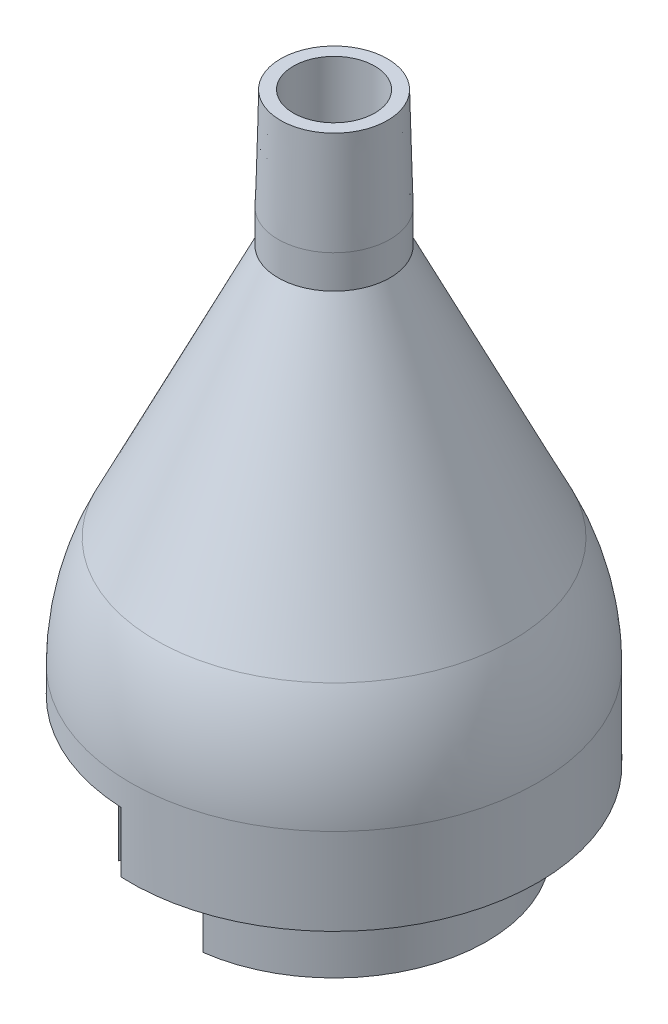
ISO-10303-21;
HEADER;
FILE_DESCRIPTION(('STEP AP214'),'2;1');
FILE_NAME('part.step','',(''),(''),'','','');
FILE_SCHEMA(('AUTOMOTIVE_DESIGN { 1 0 10303 214 1 1 1 1 }'));
ENDSEC;
DATA;
#1=APPLICATION_CONTEXT('core data for automotive mechanical design processes');
#2=APPLICATION_PROTOCOL_DEFINITION('international standard','automotive_design',2000,#1);
#3=PRODUCT_CONTEXT('',#1,'mechanical');
#4=PRODUCT('Part','Part','',(#3));
#5=PRODUCT_RELATED_PRODUCT_CATEGORY('part','',(#4));
#6=PRODUCT_DEFINITION_FORMATION('','',#4);
#7=PRODUCT_DEFINITION_CONTEXT('part definition',#1,'design');
#8=PRODUCT_DEFINITION('design','',#6,#7);
#9=PRODUCT_DEFINITION_SHAPE('','',#8);
#10=(LENGTH_UNIT() NAMED_UNIT(*) SI_UNIT(.MILLI.,.METRE.));
#11=(NAMED_UNIT(*) PLANE_ANGLE_UNIT() SI_UNIT($,.RADIAN.));
#12=(NAMED_UNIT(*) SI_UNIT($,.STERADIAN.) SOLID_ANGLE_UNIT());
#13=UNCERTAINTY_MEASURE_WITH_UNIT(LENGTH_MEASURE(1.E-05),#10,'distance_accuracy_value','');
#14=(GEOMETRIC_REPRESENTATION_CONTEXT(3) GLOBAL_UNCERTAINTY_ASSIGNED_CONTEXT((#13)) GLOBAL_UNIT_ASSIGNED_CONTEXT((#10,
#11,#12)) REPRESENTATION_CONTEXT('',''));
#15=CARTESIAN_POINT('',(0.,0.,0.));
#16=DIRECTION('',(0.,0.,1.));
#17=DIRECTION('',(1.,0.,0.));
#18=AXIS2_PLACEMENT_3D('',#15,#16,#17);
#19=CARTESIAN_POINT('',(0.,0.,0.));
#20=DIRECTION('',(0.,1.,0.));
#21=DIRECTION('',(0.,0.,1.));
#22=AXIS2_PLACEMENT_3D('',#19,#20,#21);
#23=PLANE('',#22);
#24=CARTESIAN_POINT('',(-21.1602690825293,0.,-29.1246117974979));
#25=DIRECTION('',(0.,-1.,0.));
#26=DIRECTION('',(0.,0.,-1.));
#27=AXIS2_PLACEMENT_3D('',#24,#25,#26);
#28=CIRCLE('',#27,1.5);
#29=CARTESIAN_POINT('',(-21.1602690825293,0.,-30.6246117974979));
#30=VERTEX_POINT('',#29);
#31=EDGE_CURVE('E394',#30,#30,#28,.T.);
#32=ORIENTED_EDGE('',*,*,#31,.F.);
#33=EDGE_LOOP('',(#32));
#34=FACE_BOUND('',#33,.T.);
#35=CARTESIAN_POINT('',(-34.2380345866256,0.,-11.1246117974978));
#36=DIRECTION('',(0.,-1.,0.));
#37=DIRECTION('',(0.,0.,-1.));
#38=AXIS2_PLACEMENT_3D('',#35,#36,#37);
#39=CIRCLE('',#38,1.5);
#40=CARTESIAN_POINT('',(-34.2380345866256,0.,-12.6246117974978));
#41=VERTEX_POINT('',#40);
#42=EDGE_CURVE('E386',#41,#41,#39,.T.);
#43=ORIENTED_EDGE('',*,*,#42,.F.);
#44=EDGE_LOOP('',(#43));
#45=FACE_BOUND('',#44,.T.);
#46=CARTESIAN_POINT('',(-34.2380345866254,0.,11.1246117974985));
#47=DIRECTION('',(0.,-1.,0.));
#48=DIRECTION('',(0.,0.,-1.));
#49=AXIS2_PLACEMENT_3D('',#46,#47,#48);
#50=CIRCLE('',#49,1.5);
#51=CARTESIAN_POINT('',(-34.2380345866254,0.,9.62461179749849));
#52=VERTEX_POINT('',#51);
#53=EDGE_CURVE('E393',#52,#52,#50,.T.);
#54=ORIENTED_EDGE('',*,*,#53,.F.);
#55=EDGE_LOOP('',(#54));
#56=FACE_BOUND('',#55,.T.);
#57=DIRECTION('',(-0.819178042205052,0.,0.573539305688021));
#58=VECTOR('',#57,1.);
#59=CARTESIAN_POINT('',(-3.81627640035369,0.,-5.45073336587605));
#60=LINE('',#59,#58);
#61=CARTESIAN_POINT('',(-30.2939246678071,0.,13.0873270082637));
#62=VERTEX_POINT('',#61);
#63=CARTESIAN_POINT('',(-36.126859333869,0.,17.1711978228324));
#64=VERTEX_POINT('',#63);
#65=EDGE_CURVE('E378',#62,#64,#60,.T.);
#66=ORIENTED_EDGE('',*,*,#65,.T.);
#67=CARTESIAN_POINT('',(0.,0.,0.));
#68=DIRECTION('',(0.,1.,0.));
#69=DIRECTION('',(0.,0.,1.));
#70=AXIS2_PLACEMENT_3D('',#67,#68,#69);
#71=CIRCLE('',#70,40.);
#72=CARTESIAN_POINT('',(-19.5058879135128,0.,-34.9216313580204));
#73=VERTEX_POINT('',#72);
#74=EDGE_CURVE('E230',#73,#64,#71,.T.);
#75=ORIENTED_EDGE('',*,*,#74,.F.);
#76=DIRECTION('',(-0.487647197837817,0.,-0.873040783950512));
#77=VECTOR('',#76,1.);
#78=CARTESIAN_POINT('',(-1.40847043936586E-13,0.,0.));
#79=LINE('',#78,#77);
#80=CARTESIAN_POINT('',(-16.0923575286481,0.,-28.8103458703668));
#81=VERTEX_POINT('',#80);
#82=EDGE_CURVE('E429',#81,#73,#79,.T.);
#83=ORIENTED_EDGE('',*,*,#82,.F.);
#84=CARTESIAN_POINT('',(0.,0.,0.));
#85=DIRECTION('',(0.,-1.,0.));
#86=DIRECTION('',(0.,0.,-1.));
#87=AXIS2_PLACEMENT_3D('',#84,#85,#86);
#88=CIRCLE('',#87,33.);
#89=EDGE_CURVE('E426',#62,#81,#88,.T.);
#90=ORIENTED_EDGE('',*,*,#89,.F.);
#91=EDGE_LOOP('',(#66,#75,#83,#90));
#92=FACE_BOUND('',#91,.T.);
#93=ADVANCED_FACE('F105',(#34,#45,#56,#92),#23,.F.);
#94=CARTESIAN_POINT('',(0.,50.,0.));
#95=DIRECTION('',(0.,-1.,0.));
#96=DIRECTION('',(0.,0.,-1.));
#97=AXIS2_PLACEMENT_3D('',#94,#95,#96);
#98=CYLINDRICAL_SURFACE('',#97,40.);
#99=CARTESIAN_POINT('',(0.,17.0080650353958,0.));
#100=DIRECTION('',(0.,-1.,0.));
#101=DIRECTION('',(0.,0.,-1.));
#102=AXIS2_PLACEMENT_3D('',#99,#100,#101);
#103=CIRCLE('',#102,40.);
#104=CARTESIAN_POINT('',(0.,17.0080650353958,-40.));
#105=VERTEX_POINT('',#104);
#106=EDGE_CURVE('E608',#105,#105,#103,.T.);
#107=ORIENTED_EDGE('',*,*,#106,.T.);
#108=EDGE_LOOP('',(#107));
#109=FACE_BOUND('',#108,.T.);
#110=DIRECTION('',(0.,-1.,0.));
#111=VECTOR('',#110,1.);
#112=CARTESIAN_POINT('',(-36.126859333869,11.84997677,17.1711978228324));
#113=LINE('',#112,#111);
#114=CARTESIAN_POINT('',(-36.126859333869,11.84997677,17.1711978228324));
#115=VERTEX_POINT('',#114);
#116=EDGE_CURVE('E440',#115,#64,#113,.T.);
#117=ORIENTED_EDGE('',*,*,#116,.F.);
#118=CARTESIAN_POINT('',(0.,11.84997677,0.));
#119=DIRECTION('',(0.,-1.,0.));
#120=DIRECTION('',(0.,0.,-1.));
#121=AXIS2_PLACEMENT_3D('',#118,#119,#120);
#122=CIRCLE('',#121,40.);
#123=CARTESIAN_POINT('',(-1.9505371321681,11.84997677,39.9524142561627));
#124=VERTEX_POINT('',#123);
#125=EDGE_CURVE('E245',#124,#115,#122,.T.);
#126=ORIENTED_EDGE('',*,*,#125,.F.);
#127=DIRECTION('',(0.,-1.,0.));
#128=VECTOR('',#127,1.);
#129=CARTESIAN_POINT('',(-1.9505371321681,11.84997677,39.9524142561627));
#130=LINE('',#129,#128);
#131=CARTESIAN_POINT('',(-1.9505371321681,0.,39.9524142561627));
#132=VERTEX_POINT('',#131);
#133=EDGE_CURVE('E384',#124,#132,#130,.T.);
#134=ORIENTED_EDGE('',*,*,#133,.T.);
#135=CARTESIAN_POINT('',(4.19737007297038,0.,-39.7791664627419));
#136=VERTEX_POINT('',#135);
#137=EDGE_CURVE('E381',#132,#136,#71,.T.);
#138=ORIENTED_EDGE('',*,*,#137,.T.);
#139=DIRECTION('',(0.,-1.,0.));
#140=VECTOR('',#139,1.);
#141=CARTESIAN_POINT('',(4.19737007297038,11.84997677,-39.7791664627419));
#142=LINE('',#141,#140);
#143=CARTESIAN_POINT('',(4.19737007297038,11.84997677,-39.7791664627419));
#144=VERTEX_POINT('',#143);
#145=EDGE_CURVE('E432',#144,#136,#142,.T.);
#146=ORIENTED_EDGE('',*,*,#145,.F.);
#147=CARTESIAN_POINT('',(-19.5058879135128,11.84997677,-34.9216313580204));
#148=VERTEX_POINT('',#147);
#149=EDGE_CURVE('E250',#148,#144,#122,.T.);
#150=ORIENTED_EDGE('',*,*,#149,.F.);
#151=DIRECTION('',(0.,-1.,0.));
#152=VECTOR('',#151,1.);
#153=CARTESIAN_POINT('',(-19.5058879135128,11.84997677,-34.9216313580204));
#154=LINE('',#153,#152);
#155=EDGE_CURVE('E383',#148,#73,#154,.T.);
#156=ORIENTED_EDGE('',*,*,#155,.T.);
#157=ORIENTED_EDGE('',*,*,#74,.T.);
#158=EDGE_LOOP('',(#117,#126,#134,#138,#146,#150,#156,#157));
#159=FACE_BOUND('',#158,.T.);
#160=ADVANCED_FACE('F482',(#109,#159),#98,.T.);
#161=CARTESIAN_POINT('',(21.1602690825291,0.,29.1246117974981));
#162=DIRECTION('',(0.,-1.,0.));
#163=DIRECTION('',(0.,0.,-1.));
#164=AXIS2_PLACEMENT_3D('',#161,#162,#163);
#165=CIRCLE('',#164,1.5);
#166=CARTESIAN_POINT('',(21.1602690825291,0.,27.6246117974981));
#167=VERTEX_POINT('',#166);
#168=EDGE_CURVE('E416',#167,#167,#165,.T.);
#169=ORIENTED_EDGE('',*,*,#168,.F.);
#170=EDGE_LOOP('',(#169));
#171=FACE_BOUND('',#170,.T.);
#172=CARTESIAN_POINT('',(34.2380345866255,0.,-11.1246117974983));
#173=DIRECTION('',(0.,-1.,0.));
#174=DIRECTION('',(0.,0.,-1.));
#175=AXIS2_PLACEMENT_3D('',#172,#173,#174);
#176=CIRCLE('',#175,1.5);
#177=CARTESIAN_POINT('',(34.2380345866255,0.,-12.6246117974983));
#178=VERTEX_POINT('',#177);
#179=EDGE_CURVE('E400',#178,#178,#176,.T.);
#180=ORIENTED_EDGE('',*,*,#179,.F.);
#181=EDGE_LOOP('',(#180));
#182=FACE_BOUND('',#181,.T.);
#183=CARTESIAN_POINT('',(34.2380345866256,0.,11.124611797498));
#184=DIRECTION('',(0.,-1.,0.));
#185=DIRECTION('',(0.,0.,-1.));
#186=AXIS2_PLACEMENT_3D('',#183,#184,#185);
#187=CIRCLE('',#186,1.5);
#188=CARTESIAN_POINT('',(34.2380345866256,0.,9.62461179749802));
#189=VERTEX_POINT('',#188);
#190=EDGE_CURVE('E406',#189,#189,#187,.T.);
#191=ORIENTED_EDGE('',*,*,#190,.F.);
#192=EDGE_LOOP('',(#191));
#193=FACE_BOUND('',#192,.T.);
#194=ORIENTED_EDGE('',*,*,#137,.F.);
#195=DIRECTION('',(-0.0487634283041756,0.,0.998810356404069));
#196=VECTOR('',#195,1.);
#197=CARTESIAN_POINT('',(-1.07793096146607E-12,0.,0.));
#198=LINE('',#197,#196);
#199=CARTESIAN_POINT('',(-1.46290284912635,0.,29.964310692122));
#200=VERTEX_POINT('',#199);
#201=EDGE_CURVE('E229',#200,#132,#198,.T.);
#202=ORIENTED_EDGE('',*,*,#201,.F.);
#203=CARTESIAN_POINT('',(0.,0.,0.));
#204=DIRECTION('',(0.,1.,0.));
#205=DIRECTION('',(0.,0.,1.));
#206=AXIS2_PLACEMENT_3D('',#203,#204,#205);
#207=CIRCLE('',#206,30.);
#208=CARTESIAN_POINT('',(4.00883862894171,0.,29.7309470560072));
#209=VERTEX_POINT('',#208);
#210=EDGE_CURVE('E213',#200,#209,#207,.T.);
#211=ORIENTED_EDGE('',*,*,#210,.T.);
#212=CARTESIAN_POINT('',(0.,0.,0.));
#213=DIRECTION('',(0.,1.,0.));
#214=DIRECTION('',(0.,0.,1.));
#215=AXIS2_PLACEMENT_3D('',#212,#213,#214);
#216=CIRCLE('',#215,30.);
#217=CARTESIAN_POINT('',(3.14802755472722,0.,-29.8343748470565));
#218=VERTEX_POINT('',#217);
#219=EDGE_CURVE('E227',#209,#218,#216,.T.);
#220=ORIENTED_EDGE('',*,*,#219,.T.);
#221=DIRECTION('',(0.104934251824316,0.,-0.994479161568542));
#222=VECTOR('',#221,1.);
#223=CARTESIAN_POINT('',(-2.26511715484874E-12,0.,-2.39007897926772E-13));
#224=LINE('',#223,#222);
#225=EDGE_CURVE('E218',#218,#136,#224,.T.);
#226=ORIENTED_EDGE('',*,*,#225,.T.);
#227=EDGE_LOOP('',(#194,#202,#211,#220,#226));
#228=FACE_BOUND('',#227,.T.);
#229=ADVANCED_FACE('F225',(#171,#182,#193,#228),#23,.F.);
#230=CARTESIAN_POINT('',(0.,50.,0.));
#231=DIRECTION('',(0.,-1.,0.));
#232=DIRECTION('',(0.,0.,-1.));
#233=AXIS2_PLACEMENT_3D('',#230,#231,#232);
#234=CYLINDRICAL_SURFACE('',#233,30.);
#235=DIRECTION('',(0.,-1.,0.));
#236=VECTOR('',#235,1.);
#237=CARTESIAN_POINT('',(-19.9092408020485,21.84997677,22.441526924121));
#238=LINE('',#237,#236);
#239=CARTESIAN_POINT('',(-19.9092408020485,19.5800844217819,22.441526924121));
#240=VERTEX_POINT('',#239);
#241=CARTESIAN_POINT('',(-19.9092408020485,11.84997677,22.441526924121));
#242=VERTEX_POINT('',#241);
#243=EDGE_CURVE('E253',#240,#242,#238,.T.);
#244=ORIENTED_EDGE('',*,*,#243,.F.);
#245=CARTESIAN_POINT('',(0.,19.5800844217819,0.));
#246=DIRECTION('',(0.,1.,0.));
#247=DIRECTION('',(0.,0.,1.));
#248=AXIS2_PLACEMENT_3D('',#245,#246,#247);
#249=CIRCLE('',#248,30.);
#250=CARTESIAN_POINT('',(4.0088386289417,19.5800844217819,29.7309470560072));
#251=VERTEX_POINT('',#250);
#252=EDGE_CURVE('E215',#240,#251,#249,.T.);
#253=ORIENTED_EDGE('',*,*,#252,.T.);
#254=DIRECTION('',(0.,-1.,0.));
#255=VECTOR('',#254,1.);
#256=CARTESIAN_POINT('',(4.0088386289417,21.84997677,29.7309470560072));
#257=LINE('',#256,#255);
#258=EDGE_CURVE('E208',#251,#209,#257,.T.);
#259=ORIENTED_EDGE('',*,*,#258,.T.);
#260=ORIENTED_EDGE('',*,*,#210,.F.);
#261=DIRECTION('',(0.,-1.,0.));
#262=VECTOR('',#261,1.);
#263=CARTESIAN_POINT('',(-1.46290284912635,11.84997677,29.964310692122));
#264=LINE('',#263,#262);
#265=CARTESIAN_POINT('',(-1.46290284912635,11.84997677,29.964310692122));
#266=VERTEX_POINT('',#265);
#267=EDGE_CURVE('E436',#266,#200,#264,.T.);
#268=ORIENTED_EDGE('',*,*,#267,.F.);
#269=CARTESIAN_POINT('',(0.,11.84997677,0.));
#270=DIRECTION('',(0.,-1.,0.));
#271=DIRECTION('',(0.,0.,-1.));
#272=AXIS2_PLACEMENT_3D('',#269,#270,#271);
#273=CIRCLE('',#272,30.);
#274=EDGE_CURVE('E217',#266,#242,#273,.T.);
#275=ORIENTED_EDGE('',*,*,#274,.T.);
#276=EDGE_LOOP('',(#244,#253,#259,#260,#268,#275));
#277=FACE_BOUND('',#276,.T.);
#278=ADVANCED_FACE('F211',(#277),#234,.F.);
#279=CARTESIAN_POINT('',(34.2380345866256,10.,11.124611797498));
#280=DIRECTION('',(0.,-1.,0.));
#281=DIRECTION('',(0.,0.,-1.));
#282=AXIS2_PLACEMENT_3D('',#279,#280,#281);
#283=CYLINDRICAL_SURFACE('',#282,1.5);
#284=CARTESIAN_POINT('',(34.2380345866256,10.,11.124611797498));
#285=DIRECTION('',(0.,-1.,0.));
#286=DIRECTION('',(0.,0.,-1.));
#287=AXIS2_PLACEMENT_3D('',#284,#285,#286);
#288=CIRCLE('',#287,1.5);
#289=CARTESIAN_POINT('',(34.2380345866256,10.,9.62461179749802));
#290=VERTEX_POINT('',#289);
#291=EDGE_CURVE('E403',#290,#290,#288,.T.);
#292=ORIENTED_EDGE('',*,*,#291,.F.);
#293=EDGE_LOOP('',(#292));
#294=FACE_BOUND('',#293,.T.);
#295=ORIENTED_EDGE('',*,*,#190,.T.);
#296=EDGE_LOOP('',(#295));
#297=FACE_BOUND('',#296,.T.);
#298=ADVANCED_FACE('F524',(#294,#297),#283,.F.);
#299=CARTESIAN_POINT('',(34.2380345866256,10.,11.124611797498));
#300=DIRECTION('',(0.,-1.,0.));
#301=DIRECTION('',(0.,0.,-1.));
#302=AXIS2_PLACEMENT_3D('',#299,#300,#301);
#303=PLANE('',#302);
#304=ORIENTED_EDGE('',*,*,#291,.T.);
#305=EDGE_LOOP('',(#304));
#306=FACE_BOUND('',#305,.T.);
#307=ADVANCED_FACE('F532',(#306),#303,.T.);
#308=CARTESIAN_POINT('',(34.2380345866255,10.,-11.1246117974983));
#309=DIRECTION('',(0.,-1.,0.));
#310=DIRECTION('',(0.,0.,-1.));
#311=AXIS2_PLACEMENT_3D('',#308,#309,#310);
#312=CYLINDRICAL_SURFACE('',#311,1.5);
#313=CARTESIAN_POINT('',(34.2380345866255,10.,-11.1246117974983));
#314=DIRECTION('',(0.,-1.,0.));
#315=DIRECTION('',(0.,0.,-1.));
#316=AXIS2_PLACEMENT_3D('',#313,#314,#315);
#317=CIRCLE('',#316,1.5);
#318=CARTESIAN_POINT('',(34.2380345866255,10.,-12.6246117974983));
#319=VERTEX_POINT('',#318);
#320=EDGE_CURVE('E397',#319,#319,#317,.T.);
#321=ORIENTED_EDGE('',*,*,#320,.F.);
#322=EDGE_LOOP('',(#321));
#323=FACE_BOUND('',#322,.T.);
#324=ORIENTED_EDGE('',*,*,#179,.T.);
#325=EDGE_LOOP('',(#324));
#326=FACE_BOUND('',#325,.T.);
#327=ADVANCED_FACE('F538',(#323,#326),#312,.F.);
#328=CARTESIAN_POINT('',(34.2380345866255,10.,-11.1246117974983));
#329=DIRECTION('',(0.,-1.,0.));
#330=DIRECTION('',(0.,0.,-1.));
#331=AXIS2_PLACEMENT_3D('',#328,#329,#330);
#332=PLANE('',#331);
#333=ORIENTED_EDGE('',*,*,#320,.T.);
#334=EDGE_LOOP('',(#333));
#335=FACE_BOUND('',#334,.T.);
#336=ADVANCED_FACE('F543',(#335),#332,.T.);
#337=CARTESIAN_POINT('',(-21.1602690825293,10.,-29.1246117974979));
#338=DIRECTION('',(0.,-1.,0.));
#339=DIRECTION('',(0.,0.,-1.));
#340=AXIS2_PLACEMENT_3D('',#337,#338,#339);
#341=CYLINDRICAL_SURFACE('',#340,1.5);
#342=CARTESIAN_POINT('',(-21.1602690825293,10.,-29.1246117974979));
#343=DIRECTION('',(0.,-1.,0.));
#344=DIRECTION('',(0.,0.,-1.));
#345=AXIS2_PLACEMENT_3D('',#342,#343,#344);
#346=CIRCLE('',#345,1.5);
#347=CARTESIAN_POINT('',(-21.1602690825293,10.,-30.6246117974979));
#348=VERTEX_POINT('',#347);
#349=EDGE_CURVE('E390',#348,#348,#346,.T.);
#350=ORIENTED_EDGE('',*,*,#349,.F.);
#351=EDGE_LOOP('',(#350));
#352=FACE_BOUND('',#351,.T.);
#353=ORIENTED_EDGE('',*,*,#31,.T.);
#354=EDGE_LOOP('',(#353));
#355=FACE_BOUND('',#354,.T.);
#356=ADVANCED_FACE('F785',(#352,#355),#341,.F.);
#357=CARTESIAN_POINT('',(-21.1602690825293,10.,-29.1246117974979));
#358=DIRECTION('',(0.,-1.,0.));
#359=DIRECTION('',(0.,0.,-1.));
#360=AXIS2_PLACEMENT_3D('',#357,#358,#359);
#361=PLANE('',#360);
#362=ORIENTED_EDGE('',*,*,#349,.T.);
#363=EDGE_LOOP('',(#362));
#364=FACE_BOUND('',#363,.T.);
#365=ADVANCED_FACE('F775',(#364),#361,.T.);
#366=CARTESIAN_POINT('',(-34.2380345866256,10.,-11.1246117974978));
#367=DIRECTION('',(0.,-1.,0.));
#368=DIRECTION('',(0.,0.,-1.));
#369=AXIS2_PLACEMENT_3D('',#366,#367,#368);
#370=CYLINDRICAL_SURFACE('',#369,1.5);
#371=CARTESIAN_POINT('',(-34.2380345866256,10.,-11.1246117974978));
#372=DIRECTION('',(0.,-1.,0.));
#373=DIRECTION('',(0.,0.,-1.));
#374=AXIS2_PLACEMENT_3D('',#371,#372,#373);
#375=CIRCLE('',#374,1.5);
#376=CARTESIAN_POINT('',(-34.2380345866256,10.,-12.6246117974978));
#377=VERTEX_POINT('',#376);
#378=EDGE_CURVE('E389',#377,#377,#375,.T.);
#379=ORIENTED_EDGE('',*,*,#378,.F.);
#380=EDGE_LOOP('',(#379));
#381=FACE_BOUND('',#380,.T.);
#382=ORIENTED_EDGE('',*,*,#42,.T.);
#383=EDGE_LOOP('',(#382));
#384=FACE_BOUND('',#383,.T.);
#385=ADVANCED_FACE('F765',(#381,#384),#370,.F.);
#386=CARTESIAN_POINT('',(-34.2380345866256,10.,-11.1246117974978));
#387=DIRECTION('',(0.,-1.,0.));
#388=DIRECTION('',(0.,0.,-1.));
#389=AXIS2_PLACEMENT_3D('',#386,#387,#388);
#390=PLANE('',#389);
#391=ORIENTED_EDGE('',*,*,#378,.T.);
#392=EDGE_LOOP('',(#391));
#393=FACE_BOUND('',#392,.T.);
#394=ADVANCED_FACE('F550',(#393),#390,.T.);
#395=CARTESIAN_POINT('',(-34.2380345866254,10.,11.1246117974985));
#396=DIRECTION('',(0.,-1.,0.));
#397=DIRECTION('',(0.,0.,-1.));
#398=AXIS2_PLACEMENT_3D('',#395,#396,#397);
#399=CYLINDRICAL_SURFACE('',#398,1.5);
#400=CARTESIAN_POINT('',(-34.2380345866254,10.,11.1246117974985));
#401=DIRECTION('',(0.,-1.,0.));
#402=DIRECTION('',(0.,0.,-1.));
#403=AXIS2_PLACEMENT_3D('',#400,#401,#402);
#404=CIRCLE('',#403,1.5);
#405=CARTESIAN_POINT('',(-34.2380345866254,10.,9.62461179749849));
#406=VERTEX_POINT('',#405);
#407=EDGE_CURVE('E413',#406,#406,#404,.T.);
#408=ORIENTED_EDGE('',*,*,#407,.F.);
#409=EDGE_LOOP('',(#408));
#410=FACE_BOUND('',#409,.T.);
#411=ORIENTED_EDGE('',*,*,#53,.T.);
#412=EDGE_LOOP('',(#411));
#413=FACE_BOUND('',#412,.T.);
#414=ADVANCED_FACE('F546',(#410,#413),#399,.F.);
#415=CARTESIAN_POINT('',(-34.2380345866254,10.,11.1246117974985));
#416=DIRECTION('',(0.,-1.,0.));
#417=DIRECTION('',(0.,0.,-1.));
#418=AXIS2_PLACEMENT_3D('',#415,#416,#417);
#419=PLANE('',#418);
#420=ORIENTED_EDGE('',*,*,#407,.T.);
#421=EDGE_LOOP('',(#420));
#422=FACE_BOUND('',#421,.T.);
#423=ADVANCED_FACE('F549',(#422),#419,.T.);
#424=CARTESIAN_POINT('',(21.1602690825291,10.,29.1246117974981));
#425=DIRECTION('',(0.,-1.,0.));
#426=DIRECTION('',(0.,0.,-1.));
#427=AXIS2_PLACEMENT_3D('',#424,#425,#426);
#428=CYLINDRICAL_SURFACE('',#427,1.5);
#429=CARTESIAN_POINT('',(21.1602690825291,10.,29.1246117974981));
#430=DIRECTION('',(0.,-1.,0.));
#431=DIRECTION('',(0.,0.,-1.));
#432=AXIS2_PLACEMENT_3D('',#429,#430,#431);
#433=CIRCLE('',#432,1.5);
#434=CARTESIAN_POINT('',(21.1602690825291,10.,27.6246117974981));
#435=VERTEX_POINT('',#434);
#436=EDGE_CURVE('E419',#435,#435,#433,.T.);
#437=ORIENTED_EDGE('',*,*,#436,.F.);
#438=EDGE_LOOP('',(#437));
#439=FACE_BOUND('',#438,.T.);
#440=ORIENTED_EDGE('',*,*,#168,.T.);
#441=EDGE_LOOP('',(#440));
#442=FACE_BOUND('',#441,.T.);
#443=ADVANCED_FACE('F554',(#439,#442),#428,.F.);
#444=CARTESIAN_POINT('',(21.1602690825291,10.,29.1246117974981));
#445=DIRECTION('',(0.,-1.,0.));
#446=DIRECTION('',(0.,0.,-1.));
#447=AXIS2_PLACEMENT_3D('',#444,#445,#446);
#448=PLANE('',#447);
#449=ORIENTED_EDGE('',*,*,#436,.T.);
#450=EDGE_LOOP('',(#449));
#451=FACE_BOUND('',#450,.T.);
#452=ADVANCED_FACE('F558',(#451),#448,.T.);
#453=CARTESIAN_POINT('',(-3.81627640035369,11.84997677,-5.45073336587605));
#454=DIRECTION('',(0.573539305688021,0.,0.819178042205052));
#455=DIRECTION('',(0.819178042205053,0.,-0.573539305688021));
#456=AXIS2_PLACEMENT_3D('',#453,#454,#455);
#457=PLANE('',#456);
#458=ORIENTED_EDGE('',*,*,#65,.F.);
#459=DIRECTION('',(0.,-1.,0.));
#460=VECTOR('',#459,1.);
#461=CARTESIAN_POINT('',(-30.2939246678071,11.84997677,13.0873270082637));
#462=LINE('',#461,#460);
#463=CARTESIAN_POINT('',(-30.2939246678071,11.84997677,13.0873270082637));
#464=VERTEX_POINT('',#463);
#465=EDGE_CURVE('E423',#464,#62,#462,.T.);
#466=ORIENTED_EDGE('',*,*,#465,.F.);
#467=DIRECTION('',(-0.819178042205052,0.,0.573539305688021));
#468=VECTOR('',#467,1.);
#469=CARTESIAN_POINT('',(-3.81627640035369,11.84997677,-5.45073336587605));
#470=LINE('',#469,#468);
#471=EDGE_CURVE('E422',#464,#115,#470,.T.);
#472=ORIENTED_EDGE('',*,*,#471,.T.);
#473=ORIENTED_EDGE('',*,*,#116,.T.);
#474=EDGE_LOOP('',(#458,#466,#472,#473));
#475=FACE_BOUND('',#474,.T.);
#476=ADVANCED_FACE('F487',(#475),#457,.T.);
#477=CARTESIAN_POINT('',(-1.07793096146607E-12,11.84997677,0.));
#478=DIRECTION('',(0.998810356404069,0.,0.0487634283041756));
#479=DIRECTION('',(0.0487634283041756,0.,-0.998810356404069));
#480=AXIS2_PLACEMENT_3D('',#477,#478,#479);
#481=PLANE('',#480);
#482=ORIENTED_EDGE('',*,*,#201,.T.);
#483=ORIENTED_EDGE('',*,*,#133,.F.);
#484=DIRECTION('',(-0.0487634283041756,0.,0.998810356404069));
#485=VECTOR('',#484,1.);
#486=CARTESIAN_POINT('',(-1.07793096146607E-12,11.84997677,0.));
#487=LINE('',#486,#485);
#488=EDGE_CURVE('E248',#266,#124,#487,.T.);
#489=ORIENTED_EDGE('',*,*,#488,.F.);
#490=ORIENTED_EDGE('',*,*,#267,.T.);
#491=EDGE_LOOP('',(#482,#483,#489,#490));
#492=FACE_BOUND('',#491,.T.);
#493=ADVANCED_FACE('F478',(#492),#481,.F.);
#494=CARTESIAN_POINT('',(-2.26511715484874E-12,11.84997677,-2.39007897926772E-13));
#495=DIRECTION('',(-0.994479161568543,0.,-0.104934251824316));
#496=DIRECTION('',(-0.104934251824316,0.,0.994479161568543));
#497=AXIS2_PLACEMENT_3D('',#494,#495,#496);
#498=PLANE('',#497);
#499=ORIENTED_EDGE('',*,*,#225,.F.);
#500=DIRECTION('',(0.,-1.,0.));
#501=VECTOR('',#500,1.);
#502=CARTESIAN_POINT('',(3.14802755472722,11.84997677,-29.8343748470565));
#503=LINE('',#502,#501);
#504=CARTESIAN_POINT('',(3.14802755472722,11.84997677,-29.8343748470565));
#505=VERTEX_POINT('',#504);
#506=EDGE_CURVE('E238',#505,#218,#503,.T.);
#507=ORIENTED_EDGE('',*,*,#506,.F.);
#508=DIRECTION('',(0.104934251824316,0.,-0.994479161568542));
#509=VECTOR('',#508,1.);
#510=CARTESIAN_POINT('',(-2.26511715484874E-12,11.84997677,-2.39007897926772E-13));
#511=LINE('',#510,#509);
#512=EDGE_CURVE('E434',#505,#144,#511,.T.);
#513=ORIENTED_EDGE('',*,*,#512,.T.);
#514=ORIENTED_EDGE('',*,*,#145,.T.);
#515=EDGE_LOOP('',(#499,#507,#513,#514));
#516=FACE_BOUND('',#515,.T.);
#517=ADVANCED_FACE('F499',(#516),#498,.T.);
#518=CARTESIAN_POINT('',(-1.40847043936586E-13,11.84997677,0.));
#519=DIRECTION('',(-0.873040783950512,0.,0.487647197837817));
#520=DIRECTION('',(0.487647197837817,0.,0.873040783950512));
#521=AXIS2_PLACEMENT_3D('',#518,#519,#520);
#522=PLANE('',#521);
#523=ORIENTED_EDGE('',*,*,#82,.T.);
#524=ORIENTED_EDGE('',*,*,#155,.F.);
#525=DIRECTION('',(-0.487647197837817,0.,-0.873040783950512));
#526=VECTOR('',#525,1.);
#527=CARTESIAN_POINT('',(-1.40847043936586E-13,11.84997677,0.));
#528=LINE('',#527,#526);
#529=CARTESIAN_POINT('',(-16.0923575286481,11.84997677,-28.8103458703668));
#530=VERTEX_POINT('',#529);
#531=EDGE_CURVE('E454',#530,#148,#528,.T.);
#532=ORIENTED_EDGE('',*,*,#531,.F.);
#533=DIRECTION('',(0.,-1.,0.));
#534=VECTOR('',#533,1.);
#535=CARTESIAN_POINT('',(-16.0923575286481,11.84997677,-28.8103458703668));
#536=LINE('',#535,#534);
#537=EDGE_CURVE('E427',#530,#81,#536,.T.);
#538=ORIENTED_EDGE('',*,*,#537,.T.);
#539=EDGE_LOOP('',(#523,#524,#532,#538));
#540=FACE_BOUND('',#539,.T.);
#541=ADVANCED_FACE('F501',(#540),#522,.F.);
#542=CARTESIAN_POINT('',(0.,11.84997677,0.));
#543=DIRECTION('',(0.,-1.,0.));
#544=DIRECTION('',(0.,0.,-1.));
#545=AXIS2_PLACEMENT_3D('',#542,#543,#544);
#546=CYLINDRICAL_SURFACE('',#545,33.);
#547=ORIENTED_EDGE('',*,*,#89,.T.);
#548=ORIENTED_EDGE('',*,*,#537,.F.);
#549=CARTESIAN_POINT('',(0.,11.84997677,0.));
#550=DIRECTION('',(0.,-1.,0.));
#551=DIRECTION('',(0.,0.,-1.));
#552=AXIS2_PLACEMENT_3D('',#549,#550,#551);
#553=CIRCLE('',#552,33.);
#554=EDGE_CURVE('E425',#464,#530,#553,.T.);
#555=ORIENTED_EDGE('',*,*,#554,.F.);
#556=ORIENTED_EDGE('',*,*,#465,.T.);
#557=EDGE_LOOP('',(#547,#548,#555,#556));
#558=FACE_BOUND('',#557,.T.);
#559=ADVANCED_FACE('F492',(#558),#546,.F.);
#560=CARTESIAN_POINT('',(0.,11.84997677,0.));
#561=DIRECTION('',(0.,-1.,0.));
#562=DIRECTION('',(0.,0.,-1.));
#563=AXIS2_PLACEMENT_3D('',#560,#561,#562);
#564=PLANE('',#563);
#565=ORIENTED_EDGE('',*,*,#471,.F.);
#566=ORIENTED_EDGE('',*,*,#554,.T.);
#567=ORIENTED_EDGE('',*,*,#531,.T.);
#568=ORIENTED_EDGE('',*,*,#149,.T.);
#569=ORIENTED_EDGE('',*,*,#512,.F.);
#570=EDGE_CURVE('E244',#242,#505,#273,.T.);
#571=ORIENTED_EDGE('',*,*,#570,.F.);
#572=ORIENTED_EDGE('',*,*,#274,.F.);
#573=ORIENTED_EDGE('',*,*,#488,.T.);
#574=ORIENTED_EDGE('',*,*,#125,.T.);
#575=EDGE_LOOP('',(#565,#566,#567,#568,#569,#571,#572,#573,#574));
#576=FACE_BOUND('',#575,.T.);
#577=ADVANCED_FACE('F475',(#576),#564,.T.);
#578=CARTESIAN_POINT('',(0.,21.84997677,0.));
#579=DIRECTION('',(0.,-1.,0.));
#580=DIRECTION('',(0.,0.,-1.));
#581=AXIS2_PLACEMENT_3D('',#578,#579,#580);
#582=CYLINDRICAL_SURFACE('',#581,30.);
#583=ORIENTED_EDGE('',*,*,#219,.F.);
#584=CARTESIAN_POINT('',(4.0088386289417,-15.,29.7309470560072));
#585=VERTEX_POINT('',#584);
#586=EDGE_CURVE('E220',#209,#585,#257,.T.);
#587=ORIENTED_EDGE('',*,*,#586,.T.);
#588=CARTESIAN_POINT('',(0.,-15.,0.));
#589=DIRECTION('',(0.,-1.,0.));
#590=DIRECTION('',(0.,0.,-1.));
#591=AXIS2_PLACEMENT_3D('',#588,#589,#590);
#592=CIRCLE('',#591,30.);
#593=CARTESIAN_POINT('',(-19.9092408020485,-15.,22.441526924121));
#594=VERTEX_POINT('',#593);
#595=EDGE_CURVE('E269',#594,#585,#592,.T.);
#596=ORIENTED_EDGE('',*,*,#595,.F.);
#597=EDGE_CURVE('E263',#242,#594,#238,.T.);
#598=ORIENTED_EDGE('',*,*,#597,.F.);
#599=ORIENTED_EDGE('',*,*,#570,.T.);
#600=ORIENTED_EDGE('',*,*,#506,.T.);
#601=EDGE_LOOP('',(#583,#587,#596,#598,#599,#600));
#602=FACE_BOUND('',#601,.T.);
#603=ADVANCED_FACE('F234',(#602),#582,.T.);
#604=CARTESIAN_POINT('',(0.,21.84997677,0.));
#605=DIRECTION('',(0.,-1.,0.));
#606=DIRECTION('',(0.,0.,-1.));
#607=AXIS2_PLACEMENT_3D('',#604,#605,#606);
#608=CYLINDRICAL_SURFACE('',#607,28.);
#609=DIRECTION('',(0.,-1.,0.));
#610=VECTOR('',#609,1.);
#611=CARTESIAN_POINT('',(-19.230258498937,21.84997677,20.3518342678016));
#612=LINE('',#611,#610);
#613=CARTESIAN_POINT('',(-19.230258498937,21.84997677,20.3518342678016));
#614=VERTEX_POINT('',#613);
#615=CARTESIAN_POINT('',(-19.230258498937,-15.,20.3518342678016));
#616=VERTEX_POINT('',#615);
#617=EDGE_CURVE('E266',#614,#616,#612,.T.);
#618=ORIENTED_EDGE('',*,*,#617,.T.);
#619=CARTESIAN_POINT('',(0.,-15.,0.));
#620=DIRECTION('',(0.,1.,0.));
#621=DIRECTION('',(0.,0.,-1.));
#622=AXIS2_PLACEMENT_3D('',#619,#620,#621);
#623=CIRCLE('',#622,28.);
#624=CARTESIAN_POINT('',(4.70036246264258,-15.,27.602655537462));
#625=VERTEX_POINT('',#624);
#626=EDGE_CURVE('E262',#625,#616,#623,.T.);
#627=ORIENTED_EDGE('',*,*,#626,.F.);
#628=DIRECTION('',(0.,-1.,0.));
#629=VECTOR('',#628,1.);
#630=CARTESIAN_POINT('',(4.70036246264258,21.84997677,27.602655537462));
#631=LINE('',#630,#629);
#632=CARTESIAN_POINT('',(4.70036246264258,21.84997677,27.602655537462));
#633=VERTEX_POINT('',#632);
#634=EDGE_CURVE('E255',#633,#625,#631,.T.);
#635=ORIENTED_EDGE('',*,*,#634,.F.);
#636=CARTESIAN_POINT('',(0.,21.84997677,0.));
#637=DIRECTION('',(0.,1.,0.));
#638=DIRECTION('',(0.,0.,-1.));
#639=AXIS2_PLACEMENT_3D('',#636,#637,#638);
#640=CIRCLE('',#639,28.);
#641=EDGE_CURVE('E258',#633,#614,#640,.T.);
#642=ORIENTED_EDGE('',*,*,#641,.T.);
#643=EDGE_LOOP('',(#618,#627,#635,#642));
#644=FACE_BOUND('',#643,.T.);
#645=ADVANCED_FACE('F462',(#644),#608,.F.);
#646=CARTESIAN_POINT('',(4.00883862894171,21.84997677,29.7309470560072));
#647=DIRECTION('',(-0.951056516295143,0.,-0.309016994374979));
#648=DIRECTION('',(-0.309016994374979,0.,0.951056516295143));
#649=AXIS2_PLACEMENT_3D('',#646,#647,#648);
#650=PLANE('',#649);
#651=ORIENTED_EDGE('',*,*,#258,.F.);
#652=CARTESIAN_POINT('',(4.00883862894171,19.5800844217819,29.7309470560072));
#653=CARTESIAN_POINT('',(4.00883892078754,19.9586401206922,29.7309461577981));
#654=CARTESIAN_POINT('',(4.01031234430858,20.3370756658303,29.7264114264841));
#655=CARTESIAN_POINT('',(4.01620545470113,21.0937064485696,29.7082742976462));
#656=CARTESIAN_POINT('',(4.02062514157271,21.4719016861709,29.6946719001221));
#657=CARTESIAN_POINT('',(4.02651796011955,21.84997677,29.6765356694929));
#658=B_SPLINE_CURVE_WITH_KNOTS('',3,(#652,#653,#654,#655,#656,#657),.UNSPECIFIED.,.F.,.F.,(4,2,
4),(0.,1.13539674532738,2.27079349067802),.UNSPECIFIED.);
#659=CARTESIAN_POINT('',(4.02651796011955,21.84997677,29.6765356694929));
#660=VERTEX_POINT('',#659);
#661=EDGE_CURVE('E129',#251,#660,#658,.T.);
#662=ORIENTED_EDGE('',*,*,#661,.T.);
#663=DIRECTION('',(0.309016994374979,0.,-0.951056516295143));
#664=VECTOR('',#663,1.);
#665=CARTESIAN_POINT('',(4.00883862894171,21.84997677,29.7309470560072));
#666=LINE('',#665,#664);
#667=EDGE_CURVE('E257',#660,#633,#666,.T.);
#668=ORIENTED_EDGE('',*,*,#667,.T.);
#669=ORIENTED_EDGE('',*,*,#634,.T.);
#670=DIRECTION('',(0.309016994374979,0.,-0.951056516295143));
#671=VECTOR('',#670,1.);
#672=CARTESIAN_POINT('',(4.00883862894171,-15.,29.7309470560072));
#673=LINE('',#672,#671);
#674=EDGE_CURVE('E243',#585,#625,#673,.T.);
#675=ORIENTED_EDGE('',*,*,#674,.F.);
#676=ORIENTED_EDGE('',*,*,#586,.F.);
#677=EDGE_LOOP('',(#651,#662,#668,#669,#675,#676));
#678=FACE_BOUND('',#677,.T.);
#679=ADVANCED_FACE('F241',(#678),#650,.T.);
#680=CARTESIAN_POINT('',(-19.9092408020485,21.84997677,22.441526924121));
#681=DIRECTION('',(0.951056516295143,0.,0.309016994374979));
#682=DIRECTION('',(0.309016994374979,0.,-0.951056516295143));
#683=AXIS2_PLACEMENT_3D('',#680,#681,#682);
#684=PLANE('',#683);
#685=DIRECTION('',(-0.309016994374979,0.,0.951056516295143));
#686=VECTOR('',#685,1.);
#687=CARTESIAN_POINT('',(-19.9092408020485,21.84997677,22.441526924121));
#688=LINE('',#687,#686);
#689=CARTESIAN_POINT('',(-19.8918568547886,21.84997677,22.3880246358282));
#690=VERTEX_POINT('',#689);
#691=EDGE_CURVE('E260',#614,#690,#688,.T.);
#692=ORIENTED_EDGE('',*,*,#691,.T.);
#693=CARTESIAN_POINT('',(-19.8918568547886,21.84997677,22.3880246358282));
#694=CARTESIAN_POINT('',(-19.8976512016674,21.471893721979,22.4058578018257));
#695=CARTESIAN_POINT('',(-19.9019970373784,21.0936945022821,22.4192329088488));
#696=CARTESIAN_POINT('',(-19.907791686465,20.3370637195428,22.4370670049463));
#697=CARTESIAN_POINT('',(-19.9092404998406,19.9586321565003,22.4415259940207));
#698=CARTESIAN_POINT('',(-19.9092408020485,19.5800844217819,22.441526924121));
#699=B_SPLINE_CURVE_WITH_KNOTS('',3,(#693,#694,#695,#696,#697,#698),.UNSPECIFIED.,.F.,.F.,(4,2,
4),(0.,1.13538181507246,2.27076363012618),.UNSPECIFIED.);
#700=EDGE_CURVE('E114',#690,#240,#699,.T.);
#701=ORIENTED_EDGE('',*,*,#700,.T.);
#702=ORIENTED_EDGE('',*,*,#243,.T.);
#703=ORIENTED_EDGE('',*,*,#597,.T.);
#704=DIRECTION('',(-0.309016994374979,0.,0.951056516295143));
#705=VECTOR('',#704,1.);
#706=CARTESIAN_POINT('',(-19.9092408020485,-15.,22.441526924121));
#707=LINE('',#706,#705);
#708=EDGE_CURVE('E271',#616,#594,#707,.T.);
#709=ORIENTED_EDGE('',*,*,#708,.F.);
#710=ORIENTED_EDGE('',*,*,#617,.F.);
#711=EDGE_LOOP('',(#692,#701,#702,#703,#709,#710));
#712=FACE_BOUND('',#711,.T.);
#713=ADVANCED_FACE('F466',(#712),#684,.T.);
#714=CARTESIAN_POINT('',(0.,21.84997677,0.));
#715=DIRECTION('',(0.,-1.,0.));
#716=DIRECTION('',(0.,0.,-1.));
#717=AXIS2_PLACEMENT_3D('',#714,#715,#716);
#718=PLANE('',#717);
#719=ORIENTED_EDGE('',*,*,#667,.F.);
#720=CARTESIAN_POINT('',(0.,21.84997677,0.));
#721=DIRECTION('',(0.,1.,0.));
#722=DIRECTION('',(0.,0.,1.));
#723=AXIS2_PLACEMENT_3D('',#720,#721,#722);
#724=CIRCLE('',#723,29.9484493125412);
#725=EDGE_CURVE('E121',#660,#690,#724,.T.);
#726=ORIENTED_EDGE('',*,*,#725,.T.);
#727=ORIENTED_EDGE('',*,*,#691,.F.);
#728=ORIENTED_EDGE('',*,*,#641,.F.);
#729=EDGE_LOOP('',(#719,#726,#727,#728));
#730=FACE_BOUND('',#729,.T.);
#731=ADVANCED_FACE('F579',(#730),#718,.F.);
#732=CARTESIAN_POINT('',(0.,-15.,0.));
#733=DIRECTION('',(0.,-1.,0.));
#734=DIRECTION('',(0.,0.,-1.));
#735=AXIS2_PLACEMENT_3D('',#732,#733,#734);
#736=PLANE('',#735);
#737=ORIENTED_EDGE('',*,*,#626,.T.);
#738=ORIENTED_EDGE('',*,*,#708,.T.);
#739=ORIENTED_EDGE('',*,*,#595,.T.);
#740=ORIENTED_EDGE('',*,*,#674,.T.);
#741=EDGE_LOOP('',(#737,#738,#739,#740));
#742=FACE_BOUND('',#741,.T.);
#743=ADVANCED_FACE('F469',(#742),#736,.T.);
#744=CARTESIAN_POINT('',(0.,88.4577690460588,0.));
#745=DIRECTION('',(0.,-1.,0.));
#746=DIRECTION('',(0.,0.,-1.));
#747=AXIS2_PLACEMENT_3D('',#744,#745,#746);
#748=CONICAL_SURFACE('',#747,11.,0.450225596260715);
#749=CARTESIAN_POINT('',(0.,38.7664980624095,0.));
#750=DIRECTION('',(0.,-1.,0.));
#751=DIRECTION('',(0.,0.,-1.));
#752=AXIS2_PLACEMENT_3D('',#749,#750,#751);
#753=CIRCLE('',#752,35.0174476420972);
#754=CARTESIAN_POINT('',(0.,38.7664980624095,-35.0174476420972));
#755=VERTEX_POINT('',#754);
#756=EDGE_CURVE('E268',#755,#755,#753,.F.);
#757=CARTESIAN_POINT('',(0.,88.4577690460588,0.));
#758=DIRECTION('',(0.,-1.,0.));
#759=DIRECTION('',(0.,0.,-1.));
#760=AXIS2_PLACEMENT_3D('',#757,#758,#759);
#761=CIRCLE('',#760,11.);
#762=CARTESIAN_POINT('',(0.,88.4577690460588,-11.));
#763=VERTEX_POINT('',#762);
#764=EDGE_CURVE('E368',#763,#763,#761,.F.);
#765=CARTESIAN_POINT('',(0.,38.7664980624095,-35.0174476420972));
#766=CARTESIAN_POINT('',(0.,39.2841154684891,-34.7672658958253));
#767=CARTESIAN_POINT('',(0.,39.8017328745688,-34.5170841495535));
#768=CARTESIAN_POINT('',(0.,40.8369676867282,-34.0167206570098));
#769=CARTESIAN_POINT('',(0.,41.3545850928079,-33.766538910738));
#770=CARTESIAN_POINT('',(0.,42.3898199049672,-33.2661754181943));
#771=CARTESIAN_POINT('',(0.,42.9074373110469,-33.0159936719224));
#772=CARTESIAN_POINT('',(0.,43.9426721232063,-32.5156301793787));
#773=CARTESIAN_POINT('',(0.,44.460289529286,-32.2654484331069));
#774=CARTESIAN_POINT('',(0.,45.4955243414453,-31.7650849405632));
#775=CARTESIAN_POINT('',(0.,46.013141747525,-31.5149031942913));
#776=CARTESIAN_POINT('',(0.,47.0483765596844,-31.0145397017477));
#777=CARTESIAN_POINT('',(0.,47.565993965764,-30.7643579554758));
#778=CARTESIAN_POINT('',(0.,48.6012287779234,-30.2639944629321));
#779=CARTESIAN_POINT('',(0.,49.1188461840031,-30.0138127166603));
#780=CARTESIAN_POINT('',(0.,50.1540809961624,-29.5134492241166));
#781=CARTESIAN_POINT('',(0.,50.6716984022421,-29.2632674778447));
#782=CARTESIAN_POINT('',(0.,51.7069332144015,-28.762903985301));
#783=CARTESIAN_POINT('',(0.,52.2245506204812,-28.5127222390292));
#784=CARTESIAN_POINT('',(0.,53.2597854326405,-28.0123587464855));
#785=CARTESIAN_POINT('',(0.,53.7774028387202,-27.7621770002137));
#786=CARTESIAN_POINT('',(0.,54.8126376508796,-27.26181350767));
#787=CARTESIAN_POINT('',(0.,55.3302550569593,-27.0116317613981));
#788=CARTESIAN_POINT('',(0.,56.3654898691186,-26.5112682688544));
#789=CARTESIAN_POINT('',(0.,56.8831072751983,-26.2610865225826));
#790=CARTESIAN_POINT('',(0.,57.9183420873577,-25.7607230300389));
#791=CARTESIAN_POINT('',(0.,58.4359594934373,-25.5105412837671));
#792=CARTESIAN_POINT('',(0.,59.4711943055967,-25.0101777912234));
#793=CARTESIAN_POINT('',(0.,59.9888117116764,-24.7599960449515));
#794=CARTESIAN_POINT('',(0.,61.0240465238357,-24.2596325524078));
#795=CARTESIAN_POINT('',(0.,61.5416639299154,-24.009450806136));
#796=CARTESIAN_POINT('',(0.,62.5768987420748,-23.5090873135923));
#797=CARTESIAN_POINT('',(0.,63.0945161481545,-23.2589055673204));
#798=CARTESIAN_POINT('',(0.,64.1297509603138,-22.7585420747767));
#799=CARTESIAN_POINT('',(0.,64.6473683663935,-22.5083603285049));
#800=CARTESIAN_POINT('',(0.,65.6826031785529,-22.0079968359612));
#801=CARTESIAN_POINT('',(0.,66.2002205846325,-21.7578150896894));
#802=CARTESIAN_POINT('',(0.,67.2354553967919,-21.2574515971457));
#803=CARTESIAN_POINT('',(0.,67.7530728028716,-21.0072698508738));
#804=CARTESIAN_POINT('',(0.,68.7883076150309,-20.5069063583301));
#805=CARTESIAN_POINT('',(0.,69.3059250211106,-20.2567246120583));
#806=CARTESIAN_POINT('',(0.,70.34115983327,-19.7563611195146));
#807=CARTESIAN_POINT('',(0.,70.8587772393497,-19.5061793732428));
#808=CARTESIAN_POINT('',(0.,71.894012051509,-19.0058158806991));
#809=CARTESIAN_POINT('',(0.,72.4116294575887,-18.7556341344272));
#810=CARTESIAN_POINT('',(0.,73.4468642697481,-18.2552706418835));
#811=CARTESIAN_POINT('',(0.,73.9644816758278,-18.0050888956117));
#812=CARTESIAN_POINT('',(0.,74.9997164879871,-17.504725403068));
#813=CARTESIAN_POINT('',(0.,75.5173338940668,-17.2545436567961));
#814=CARTESIAN_POINT('',(0.,76.5525687062262,-16.7541801642524));
#815=CARTESIAN_POINT('',(0.,77.0701861123058,-16.5039984179806));
#816=CARTESIAN_POINT('',(0.,78.1054209244652,-16.0036349254369));
#817=CARTESIAN_POINT('',(0.,78.6230383305449,-15.7534531791651));
#818=CARTESIAN_POINT('',(0.,79.6582731427042,-15.2530896866214));
#819=CARTESIAN_POINT('',(0.,80.1758905487839,-15.0029079403495));
#820=CARTESIAN_POINT('',(0.,81.2111253609433,-14.5025444478058));
#821=CARTESIAN_POINT('',(0.,81.728742767023,-14.252362701534));
#822=CARTESIAN_POINT('',(0.,82.7639775791823,-13.7519992089903));
#823=CARTESIAN_POINT('',(0.,83.281594985262,-13.5018174627185));
#824=CARTESIAN_POINT('',(0.,84.3168297974214,-13.0014539701748));
#825=CARTESIAN_POINT('',(0.,84.8344472035011,-12.7512722239029));
#826=CARTESIAN_POINT('',(0.,85.8696820156604,-12.2509087313592));
#827=CARTESIAN_POINT('',(0.,86.3872994217401,-12.0007269850874));
#828=CARTESIAN_POINT('',(0.,87.4225342338995,-11.5003634925437));
#829=CARTESIAN_POINT('',(0.,87.9401516399791,-11.2501817462718));
#830=CARTESIAN_POINT('',(0.,88.4577690460588,-11.));
#831=B_SPLINE_CURVE_WITH_KNOTS('',3,(#765,#766,#767,#768,#769,#770,#771,#772,#773,#774,#775,
#776,#777,#778,#779,#780,#781,#782,#783,#784,#785,#786,#787,#788,#789,#790,#791,#792,#793,#794,
#795,#796,#797,#798,#799,#800,#801,#802,#803,#804,#805,#806,#807,#808,#809,#810,#811,#812,#813,
#814,#815,#816,#817,#818,#819,#820,#821,#822,#823,#824,#825,#826,#827,#828,#829,#830),
.UNSPECIFIED.,.F.,.F.,(4,2,2,2,2,2,2,2,2,2,2,2,2,2,2,2,2,2,2,2,2,2,2,2,2,2,2,2,2,2,2,2,4),(0.,
1.72472263486005,3.44944526972009,5.17416790458015,6.89889053944019,8.62361317430024,
10.3483358091603,12.0730584440203,13.7977810788804,15.5225037137404,17.2472263486005,
18.9719489834605,20.6966716183206,22.4213942531806,24.1461168880407,25.8708395229007,
27.5955621577608,29.3202847926208,31.0450074274809,32.7697300623409,34.494452697201,
36.219175332061,37.9438979669211,39.6686206017811,41.3933432366412,43.1180658715012,
44.8427885063613,46.5675111412213,48.2922337760814,50.0169564109414,51.7416790458015,
53.4664016806615,55.1911243155215),.UNSPECIFIED.);
#832=EDGE_CURVE('BSEAM303',#755,#763,#831,.T.);
#833=ORIENTED_EDGE('',*,*,#756,.T.);
#834=ORIENTED_EDGE('',*,*,#764,.F.);
#835=ORIENTED_EDGE('',*,*,#832,.T.);
#836=ORIENTED_EDGE('',*,*,#832,.F.);
#837=EDGE_LOOP('',(#833,#835,#834,#836));
#838=FACE_BOUND('',#837,.T.);
#839=ADVANCED_FACE('F303',(#838),#748,.T.);
#840=CARTESIAN_POINT('',(0.,115.,0.));
#841=DIRECTION('',(0.,-1.,0.));
#842=DIRECTION('',(0.,0.,-1.));
#843=AXIS2_PLACEMENT_3D('',#840,#841,#842);
#844=PLANE('',#843);
#845=CARTESIAN_POINT('',(0.,115.,0.));
#846=DIRECTION('',(0.,1.,0.));
#847=DIRECTION('',(0.,0.,1.));
#848=AXIS2_PLACEMENT_3D('',#845,#846,#847);
#849=CIRCLE('',#848,8.);
#850=CARTESIAN_POINT('',(0.,115.,8.));
#851=VERTEX_POINT('',#850);
#852=EDGE_CURVE('E323',#851,#851,#849,.T.);
#853=ORIENTED_EDGE('',*,*,#852,.F.);
#854=EDGE_LOOP('',(#853));
#855=FACE_BOUND('',#854,.T.);
#856=CARTESIAN_POINT('',(0.,115.,0.));
#857=DIRECTION('',(0.,1.,0.));
#858=DIRECTION('',(0.,0.,1.));
#859=AXIS2_PLACEMENT_3D('',#856,#857,#858);
#860=CIRCLE('',#859,10.5);
#861=CARTESIAN_POINT('',(0.,115.,10.5));
#862=VERTEX_POINT('',#861);
#863=EDGE_CURVE('E314',#862,#862,#860,.F.);
#864=ORIENTED_EDGE('',*,*,#863,.F.);
#865=EDGE_LOOP('',(#864));
#866=FACE_BOUND('',#865,.T.);
#867=ADVANCED_FACE('F297',(#855,#866),#844,.F.);
#868=CARTESIAN_POINT('',(0.,75.,0.));
#869=DIRECTION('',(0.,1.,0.));
#870=DIRECTION('',(0.,0.,1.));
#871=AXIS2_PLACEMENT_3D('',#868,#869,#870);
#872=CYLINDRICAL_SURFACE('',#871,8.);
#873=CARTESIAN_POINT('',(0.,88.4577690460588,0.));
#874=DIRECTION('',(0.,-1.,0.));
#875=DIRECTION('',(0.,0.,-1.));
#876=AXIS2_PLACEMENT_3D('',#873,#874,#875);
#877=CIRCLE('',#876,8.);
#878=CARTESIAN_POINT('',(0.,88.4577690460588,-8.));
#879=VERTEX_POINT('',#878);
#880=EDGE_CURVE('E280',#879,#879,#877,.F.);
#881=ORIENTED_EDGE('',*,*,#880,.F.);
#882=EDGE_LOOP('',(#881));
#883=FACE_BOUND('',#882,.T.);
#884=ORIENTED_EDGE('',*,*,#852,.T.);
#885=EDGE_LOOP('',(#884));
#886=FACE_BOUND('',#885,.T.);
#887=ADVANCED_FACE('F286',(#883,#886),#872,.F.);
#888=CARTESIAN_POINT('',(0.,115.,0.));
#889=DIRECTION('',(0.,-1.,0.));
#890=DIRECTION('',(0.,0.,-1.));
#891=AXIS2_PLACEMENT_3D('',#888,#889,#890);
#892=CONICAL_SURFACE('',#891,10.5,0.0249947936189201);
#893=ORIENTED_EDGE('',*,*,#863,.T.);
#894=EDGE_LOOP('',(#893));
#895=FACE_BOUND('',#894,.T.);
#896=CARTESIAN_POINT('',(0.,95.,0.));
#897=DIRECTION('',(0.,1.,0.));
#898=DIRECTION('',(-1.,0.,-2.89470824284868E-11));
#899=AXIS2_PLACEMENT_3D('',#896,#897,#898);
#900=CIRCLE('',#899,11.);
#901=CARTESIAN_POINT('',(-11.,95.,-3.18417906713355E-10));
#902=VERTEX_POINT('',#901);
#903=EDGE_CURVE('E322',#902,#902,#900,.T.);
#904=ORIENTED_EDGE('',*,*,#903,.T.);
#905=EDGE_LOOP('',(#904));
#906=FACE_BOUND('',#905,.T.);
#907=ADVANCED_FACE('F296',(#895,#906),#892,.T.);
#908=CARTESIAN_POINT('',(0.,88.,0.));
#909=DIRECTION('',(0.,1.,0.));
#910=DIRECTION('',(0.,0.,1.));
#911=AXIS2_PLACEMENT_3D('',#908,#909,#910);
#912=CYLINDRICAL_SURFACE('',#911,11.);
#913=ORIENTED_EDGE('',*,*,#903,.F.);
#914=EDGE_LOOP('',(#913));
#915=FACE_BOUND('',#914,.T.);
#916=ORIENTED_EDGE('',*,*,#764,.T.);
#917=EDGE_LOOP('',(#916));
#918=FACE_BOUND('',#917,.T.);
#919=ADVANCED_FACE('F345',(#915,#918),#912,.T.);
#920=CARTESIAN_POINT('',(0.,88.4577690460588,0.));
#921=DIRECTION('',(0.,-1.,0.));
#922=DIRECTION('',(0.,0.,-1.));
#923=AXIS2_PLACEMENT_3D('',#920,#921,#922);
#924=CONICAL_SURFACE('',#923,8.,0.351444794003552);
#925=CARTESIAN_POINT('',(0.,36.7928168797031,0.));
#926=DIRECTION('',(0.,1.,0.));
#927=DIRECTION('',(0.,0.,1.));
#928=AXIS2_PLACEMENT_3D('',#925,#926,#927);
#929=CIRCLE('',#928,26.9438157943304);
#930=CARTESIAN_POINT('',(0.,36.7928168797031,-26.9438157943304));
#931=VERTEX_POINT('',#930);
#932=EDGE_CURVE('E12',#931,#931,#929,.F.);
#933=CARTESIAN_POINT('',(0.,36.7928168797031,-26.9438157943304));
#934=CARTESIAN_POINT('',(0.,37.3309934647693,-26.7464843798062));
#935=CARTESIAN_POINT('',(0.,37.8691700498355,-26.5491529652819));
#936=CARTESIAN_POINT('',(0.,38.9455232199679,-26.1544901362333));
#937=CARTESIAN_POINT('',(0.,39.4836998050341,-25.9571587217091));
#938=CARTESIAN_POINT('',(0.,40.5600529751665,-25.5624958926605));
#939=CARTESIAN_POINT('',(0.,41.0982295602327,-25.3651644781362));
#940=CARTESIAN_POINT('',(0.,42.1745827303651,-24.9705016490877));
#941=CARTESIAN_POINT('',(0.,42.7127593154314,-24.7731702345634));
#942=CARTESIAN_POINT('',(0.,43.7891124855638,-24.3785074055149));
#943=CARTESIAN_POINT('',(0.,44.32728907063,-24.1811759909906));
#944=CARTESIAN_POINT('',(0.,45.4036422407624,-23.786513161942));
#945=CARTESIAN_POINT('',(0.,45.9418188258286,-23.5891817474178));
#946=CARTESIAN_POINT('',(0.,47.018171995961,-23.1945189183692));
#947=CARTESIAN_POINT('',(0.,47.5563485810272,-22.9971875038449));
#948=CARTESIAN_POINT('',(0.,48.6327017511596,-22.6025246747964));
#949=CARTESIAN_POINT('',(0.,49.1708783362258,-22.4051932602721));
#950=CARTESIAN_POINT('',(0.,50.2472315063582,-22.0105304312235));
#951=CARTESIAN_POINT('',(0.,50.7854080914244,-21.8131990166993));
#952=CARTESIAN_POINT('',(0.,51.8617612615569,-21.4185361876507));
#953=CARTESIAN_POINT('',(0.,52.3999378466231,-21.2212047731264));
#954=CARTESIAN_POINT('',(0.,53.4762910167555,-20.8265419440779));
#955=CARTESIAN_POINT('',(0.,54.0144676018217,-20.6292105295536));
#956=CARTESIAN_POINT('',(0.,55.0908207719541,-20.2345477005051));
#957=CARTESIAN_POINT('',(0.,55.6289973570203,-20.0372162859808));
#958=CARTESIAN_POINT('',(0.,56.7053505271527,-19.6425534569322));
#959=CARTESIAN_POINT('',(0.,57.2435271122189,-19.445222042408));
#960=CARTESIAN_POINT('',(0.,58.3198802823513,-19.0505592133594));
#961=CARTESIAN_POINT('',(0.,58.8580568674175,-18.8532277988351));
#962=CARTESIAN_POINT('',(0.,59.9344100375499,-18.4585649697866));
#963=CARTESIAN_POINT('',(0.,60.4725866226161,-18.2612335552623));
#964=CARTESIAN_POINT('',(0.,61.5489397927485,-17.8665707262138));
#965=CARTESIAN_POINT('',(0.,62.0871163778148,-17.6692393116895));
#966=CARTESIAN_POINT('',(0.,63.1634695479472,-17.2745764826409));
#967=CARTESIAN_POINT('',(0.,63.7016461330134,-17.0772450681167));
#968=CARTESIAN_POINT('',(0.,64.7779993031458,-16.6825822390681));
#969=CARTESIAN_POINT('',(0.,65.316175888212,-16.4852508245438));
#970=CARTESIAN_POINT('',(0.,66.3925290583444,-16.0905879954953));
#971=CARTESIAN_POINT('',(0.,66.9307056434106,-15.893256580971));
#972=CARTESIAN_POINT('',(0.,68.007058813543,-15.4985937519225));
#973=CARTESIAN_POINT('',(0.,68.5452353986092,-15.3012623373982));
#974=CARTESIAN_POINT('',(0.,69.6215885687416,-14.9065995083496));
#975=CARTESIAN_POINT('',(0.,70.1597651538078,-14.7092680938254));
#976=CARTESIAN_POINT('',(0.,71.2361183239402,-14.3146052647768));
#977=CARTESIAN_POINT('',(0.,71.7742949090065,-14.1172738502525));
#978=CARTESIAN_POINT('',(0.,72.8506480791389,-13.722611021204));
#979=CARTESIAN_POINT('',(0.,73.3888246642051,-13.5252796066797));
#980=CARTESIAN_POINT('',(0.,74.4651778343375,-13.1306167776312));
#981=CARTESIAN_POINT('',(0.,75.0033544194037,-12.9332853631069));
#982=CARTESIAN_POINT('',(0.,76.0797075895361,-12.5386225340583));
#983=CARTESIAN_POINT('',(0.,76.6178841746023,-12.3412911195341));
#984=CARTESIAN_POINT('',(0.,77.6942373447347,-11.9466282904855));
#985=CARTESIAN_POINT('',(0.,78.2324139298009,-11.7492968759612));
#986=CARTESIAN_POINT('',(0.,79.3087670999333,-11.3546340469127));
#987=CARTESIAN_POINT('',(0.,79.8469436849995,-11.1573026323884));
#988=CARTESIAN_POINT('',(0.,80.9232968551319,-10.7626398033399));
#989=CARTESIAN_POINT('',(0.,81.4614734401981,-10.5653083888156));
#990=CARTESIAN_POINT('',(0.,82.5378266103306,-10.170645559767));
#991=CARTESIAN_POINT('',(0.,83.0760031953968,-9.97331414524275));
#992=CARTESIAN_POINT('',(0.,84.1523563655292,-9.5786513161942));
#993=CARTESIAN_POINT('',(0.,84.6905329505954,-9.38131990166992));
#994=CARTESIAN_POINT('',(0.,85.7668861207278,-8.98665707262137));
#995=CARTESIAN_POINT('',(0.,86.305062705794,-8.7893256580971));
#996=CARTESIAN_POINT('',(0.,87.3814158759264,-8.39466282904855));
#997=CARTESIAN_POINT('',(0.,87.9195924609926,-8.19733141452428));
#998=CARTESIAN_POINT('',(0.,88.4577690460588,-8.));
#999=B_SPLINE_CURVE_WITH_KNOTS('',3,(#933,#934,#935,#936,#937,#938,#939,#940,#941,#942,#943,
#944,#945,#946,#947,#948,#949,#950,#951,#952,#953,#954,#955,#956,#957,#958,#959,#960,#961,#962,
#963,#964,#965,#966,#967,#968,#969,#970,#971,#972,#973,#974,#975,#976,#977,#978,#979,#980,#981,
#982,#983,#984,#985,#986,#987,#988,#989,#990,#991,#992,#993,#994,#995,#996,#997,#998),
.UNSPECIFIED.,.F.,.F.,(4,2,2,2,2,2,2,2,2,2,2,2,2,2,2,2,2,2,2,2,2,2,2,2,2,2,2,2,2,2,2,2,4),(0.,
1.71964051907515,3.43928103815031,5.15892155722546,6.87856207630062,8.59820259537577,
10.3178431144509,12.0374836335261,13.7571241526012,15.4767646716764,17.1964051907515,
18.9160457098267,20.6356862289019,22.355326747977,24.0749672670522,25.7946077861273,
27.5142483052025,29.2338888242776,30.9535293433528,32.6731698624279,34.3928103815031,
36.1124509005782,37.8320914196534,39.5517319387285,41.2713724578037,42.9910129768788,
44.710653495954,46.4302940150292,48.1499345341043,49.8695750531795,51.5892155722546,
53.3088560913298,55.0284966104049),.UNSPECIFIED.);
#1000=EDGE_CURVE('BSEAM298',#931,#879,#999,.T.);
#1001=ORIENTED_EDGE('',*,*,#932,.T.);
#1002=ORIENTED_EDGE('',*,*,#880,.T.);
#1003=ORIENTED_EDGE('',*,*,#1000,.T.);
#1004=ORIENTED_EDGE('',*,*,#1000,.F.);
#1005=EDGE_LOOP('',(#1001,#1003,#1002,#1004));
#1006=FACE_BOUND('',#1005,.T.);
#1007=ADVANCED_FACE('F298',(#1006),#924,.F.);
#1008=CARTESIAN_POINT('',(0.,17.0080650353958,0.));
#1009=DIRECTION('',(0.,-1.,0.));
#1010=DIRECTION('',(0.,0.,-1.));
#1011=AXIS2_PLACEMENT_3D('',#1008,#1009,#1010);
#1012=DEGENERATE_TOROIDAL_SURFACE('',#1011,10.,50.,.F.);
#1013=ORIENTED_EDGE('',*,*,#106,.F.);
#1014=EDGE_LOOP('',(#1013));
#1015=FACE_BOUND('',#1014,.T.);
#1016=ORIENTED_EDGE('',*,*,#756,.F.);
#1017=EDGE_LOOP('',(#1016));
#1018=FACE_BOUND('',#1017,.T.);
#1019=ADVANCED_FACE('F596',(#1015,#1018),#1012,.F.);
#1020=CARTESIAN_POINT('',(0.,19.5800844217819,0.));
#1021=DIRECTION('',(0.,1.,0.));
#1022=DIRECTION('',(0.,0.,1.));
#1023=AXIS2_PLACEMENT_3D('',#1020,#1021,#1022);
#1024=DEGENERATE_TOROIDAL_SURFACE('',#1023,20.,50.,.F.);
#1025=ORIENTED_EDGE('',*,*,#932,.F.);
#1026=EDGE_LOOP('',(#1025));
#1027=FACE_BOUND('',#1026,.T.);
#1028=ORIENTED_EDGE('',*,*,#661,.F.);
#1029=ORIENTED_EDGE('',*,*,#252,.F.);
#1030=ORIENTED_EDGE('',*,*,#700,.F.);
#1031=ORIENTED_EDGE('',*,*,#725,.F.);
#1032=EDGE_LOOP('',(#1028,#1029,#1030,#1031));
#1033=FACE_BOUND('',#1032,.T.);
#1034=ADVANCED_FACE('F107',(#1027,#1033),#1024,.T.);
#1035=CLOSED_SHELL('',(#93,#160,#229,#278,#298,#307,#327,#336,#356,#365,#385,#394,#414,#423,
#443,#452,#476,#493,#517,#541,#559,#577,#603,#645,#679,#713,#731,#743,#839,#867,#887,#907,#919,
#1007,#1019,#1034));
#1036=MANIFOLD_SOLID_BREP('B2',#1035);
#1037=ADVANCED_BREP_SHAPE_REPRESENTATION('',(#18,#1036),#14);
#1038=SHAPE_DEFINITION_REPRESENTATION(#9,#1037);
ENDSEC;
END-ISO-10303-21;
